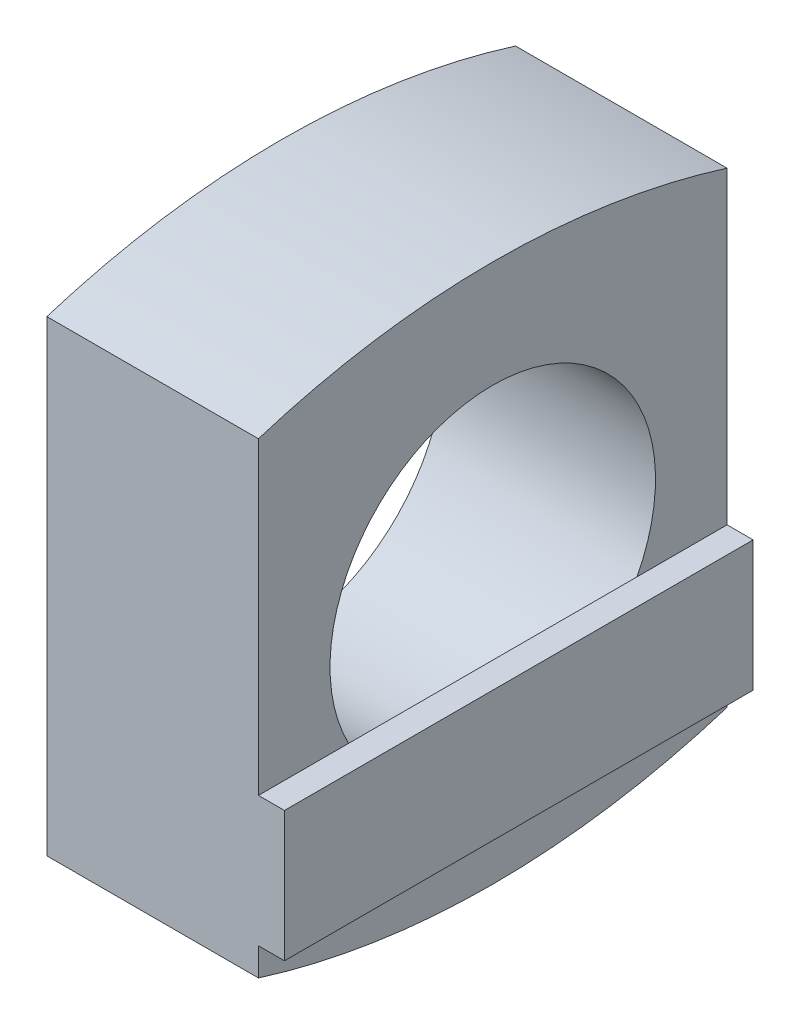
ISO-10303-21;
HEADER;
FILE_DESCRIPTION(('STEP AP214'),'2;1');
FILE_NAME('part.step','',(''),(''),'','','');
FILE_SCHEMA(('AUTOMOTIVE_DESIGN { 1 0 10303 214 1 1 1 1 }'));
ENDSEC;
DATA;
#1=APPLICATION_CONTEXT('core data for automotive mechanical design processes');
#2=APPLICATION_PROTOCOL_DEFINITION('international standard','automotive_design',2000,#1);
#3=PRODUCT_CONTEXT('',#1,'mechanical');
#4=PRODUCT('Part','Part','',(#3));
#5=PRODUCT_RELATED_PRODUCT_CATEGORY('part','',(#4));
#6=PRODUCT_DEFINITION_FORMATION('','',#4);
#7=PRODUCT_DEFINITION_CONTEXT('part definition',#1,'design');
#8=PRODUCT_DEFINITION('design','',#6,#7);
#9=PRODUCT_DEFINITION_SHAPE('','',#8);
#10=(LENGTH_UNIT() NAMED_UNIT(*) SI_UNIT(.MILLI.,.METRE.));
#11=(NAMED_UNIT(*) PLANE_ANGLE_UNIT() SI_UNIT($,.RADIAN.));
#12=(NAMED_UNIT(*) SI_UNIT($,.STERADIAN.) SOLID_ANGLE_UNIT());
#13=UNCERTAINTY_MEASURE_WITH_UNIT(LENGTH_MEASURE(1.E-05),#10,'distance_accuracy_value','');
#14=(GEOMETRIC_REPRESENTATION_CONTEXT(3) GLOBAL_UNCERTAINTY_ASSIGNED_CONTEXT((#13)) GLOBAL_UNIT_ASSIGNED_CONTEXT((#10,
#11,#12)) REPRESENTATION_CONTEXT('',''));
#15=CARTESIAN_POINT('',(0.,0.,0.));
#16=DIRECTION('',(0.,0.,1.));
#17=DIRECTION('',(1.,0.,0.));
#18=AXIS2_PLACEMENT_3D('',#15,#16,#17);
#19=CARTESIAN_POINT('',(20.6375,50.8498920527703,-83.5241282937344));
#20=DIRECTION('',(-1.,0.,0.));
#21=DIRECTION('',(0.,0.,1.));
#22=AXIS2_PLACEMENT_3D('',#19,#20,#21);
#23=PLANE('',#22);
#24=DIRECTION('',(0.,0.,1.));
#25=VECTOR('',#24,1.);
#26=CARTESIAN_POINT('',(20.6375,-6.41610430488165,-60.6641282937344));
#27=LINE('',#26,#25);
#28=CARTESIAN_POINT('',(20.6375,-6.41610430488165,-106.384128293734));
#29=VERTEX_POINT('',#28);
#30=CARTESIAN_POINT('',(20.6375,-6.41610430488165,-97.5925202977598));
#31=VERTEX_POINT('',#30);
#32=EDGE_CURVE('E43',#29,#31,#27,.T.);
#33=ORIENTED_EDGE('',*,*,#32,.F.);
#34=DIRECTION('',(0.,-1.,0.));
#35=VECTOR('',#34,1.);
#36=CARTESIAN_POINT('',(20.6375,0.938892052770313,-106.384128293734));
#37=LINE('',#36,#35);
#38=CARTESIAN_POINT('',(20.6375,23.7180592007416,-106.384128293734));
#39=VERTEX_POINT('',#38);
#40=EDGE_CURVE('E155',#39,#29,#37,.T.);
#41=ORIENTED_EDGE('',*,*,#40,.F.);
#42=CARTESIAN_POINT('',(20.6375,-48.9721079472297,-83.5241282937344));
#43=DIRECTION('',(1.,0.,0.));
#44=DIRECTION('',(0.,0.,1.));
#45=AXIS2_PLACEMENT_3D('',#42,#43,#44);
#46=CIRCLE('',#45,76.2);
#47=CARTESIAN_POINT('',(20.6375,23.7180592007416,-60.6641282937344));
#48=VERTEX_POINT('',#47);
#49=EDGE_CURVE('E133',#39,#48,#46,.T.);
#50=ORIENTED_EDGE('',*,*,#49,.T.);
#51=DIRECTION('',(0.,-1.,0.));
#52=VECTOR('',#51,1.);
#53=CARTESIAN_POINT('',(20.6375,0.938892052770313,-60.6641282937344));
#54=LINE('',#53,#52);
#55=CARTESIAN_POINT('',(20.6375,-6.41610430488165,-60.6641282937344));
#56=VERTEX_POINT('',#55);
#57=EDGE_CURVE('E161',#48,#56,#54,.T.);
#58=ORIENTED_EDGE('',*,*,#57,.T.);
#59=CARTESIAN_POINT('',(20.6375,-6.41610430488165,-69.455736289709));
#60=VERTEX_POINT('',#59);
#61=EDGE_CURVE('E11',#60,#56,#27,.T.);
#62=ORIENTED_EDGE('',*,*,#61,.F.);
#63=CARTESIAN_POINT('',(20.6375,0.938892052770313,-83.5241282937344));
#64=DIRECTION('',(1.,0.,0.));
#65=DIRECTION('',(0.,0.,-1.));
#66=AXIS2_PLACEMENT_3D('',#63,#64,#65);
#67=CIRCLE('',#66,15.875);
#68=EDGE_CURVE('E152',#31,#60,#67,.T.);
#69=ORIENTED_EDGE('',*,*,#68,.F.);
#70=EDGE_LOOP('',(#33,#41,#50,#58,#62,#69));
#71=FACE_BOUND('',#70,.T.);
#72=ADVANCED_FACE('F32',(#71),#23,.F.);
#73=DIRECTION('',(0.,0.,-1.));
#74=VECTOR('',#73,1.);
#75=CARTESIAN_POINT('',(20.6375,-19.1161043048817,-60.6641282937344));
#76=LINE('',#75,#74);
#77=CARTESIAN_POINT('',(20.6375,-19.1161043048817,-60.6641282937344));
#78=VERTEX_POINT('',#77);
#79=CARTESIAN_POINT('',(20.6375,-19.1161043048817,-106.384128293734));
#80=VERTEX_POINT('',#79);
#81=EDGE_CURVE('E58',#78,#80,#76,.T.);
#82=ORIENTED_EDGE('',*,*,#81,.F.);
#83=CARTESIAN_POINT('',(20.6375,-21.840275095201,-60.6641282937344));
#84=VERTEX_POINT('',#83);
#85=EDGE_CURVE('E129',#78,#84,#54,.T.);
#86=ORIENTED_EDGE('',*,*,#85,.T.);
#87=CARTESIAN_POINT('',(20.6375,50.8498920527703,-83.5241282937344));
#88=DIRECTION('',(-1.,0.,0.));
#89=DIRECTION('',(0.,0.,1.));
#90=AXIS2_PLACEMENT_3D('',#87,#88,#89);
#91=CIRCLE('',#90,76.2);
#92=CARTESIAN_POINT('',(20.6375,-21.840275095201,-106.384128293734));
#93=VERTEX_POINT('',#92);
#94=EDGE_CURVE('E157',#93,#84,#91,.T.);
#95=ORIENTED_EDGE('',*,*,#94,.F.);
#96=EDGE_CURVE('E158',#80,#93,#37,.T.);
#97=ORIENTED_EDGE('',*,*,#96,.F.);
#98=EDGE_LOOP('',(#82,#86,#95,#97));
#99=FACE_BOUND('',#98,.T.);
#100=ADVANCED_FACE('F200',(#99),#23,.F.);
#101=CARTESIAN_POINT('',(0.,50.8498920527703,-83.5241282937344));
#102=DIRECTION('',(-1.,0.,0.));
#103=DIRECTION('',(0.,0.,1.));
#104=AXIS2_PLACEMENT_3D('',#101,#102,#103);
#105=PLANE('',#104);
#106=CARTESIAN_POINT('',(0.,0.938892052770313,-83.5241282937344));
#107=DIRECTION('',(1.,0.,0.));
#108=DIRECTION('',(0.,0.,-1.));
#109=AXIS2_PLACEMENT_3D('',#106,#107,#108);
#110=CIRCLE('',#109,15.875);
#111=CARTESIAN_POINT('',(0.,0.938892052770313,-99.3991282937344));
#112=VERTEX_POINT('',#111);
#113=EDGE_CURVE('E145',#112,#112,#110,.T.);
#114=ORIENTED_EDGE('',*,*,#113,.T.);
#115=EDGE_LOOP('',(#114));
#116=FACE_BOUND('',#115,.T.);
#117=DIRECTION('',(0.,-1.,0.));
#118=VECTOR('',#117,1.);
#119=CARTESIAN_POINT('',(0.,0.938892052770313,-60.6641282937344));
#120=LINE('',#119,#118);
#121=CARTESIAN_POINT('',(0.,23.7180592007416,-60.6641282937344));
#122=VERTEX_POINT('',#121);
#123=CARTESIAN_POINT('',(0.,-21.840275095201,-60.6641282937344));
#124=VERTEX_POINT('',#123);
#125=EDGE_CURVE('E168',#122,#124,#120,.T.);
#126=ORIENTED_EDGE('',*,*,#125,.F.);
#127=CARTESIAN_POINT('',(0.,-48.9721079472297,-83.5241282937344));
#128=DIRECTION('',(1.,0.,0.));
#129=DIRECTION('',(0.,0.,1.));
#130=AXIS2_PLACEMENT_3D('',#127,#128,#129);
#131=CIRCLE('',#130,76.2);
#132=CARTESIAN_POINT('',(0.,23.7180592007416,-106.384128293734));
#133=VERTEX_POINT('',#132);
#134=EDGE_CURVE('E130',#133,#122,#131,.T.);
#135=ORIENTED_EDGE('',*,*,#134,.F.);
#136=DIRECTION('',(0.,-1.,0.));
#137=VECTOR('',#136,1.);
#138=CARTESIAN_POINT('',(0.,0.938892052770313,-106.384128293734));
#139=LINE('',#138,#137);
#140=CARTESIAN_POINT('',(0.,-21.840275095201,-106.384128293734));
#141=VERTEX_POINT('',#140);
#142=EDGE_CURVE('E151',#133,#141,#139,.T.);
#143=ORIENTED_EDGE('',*,*,#142,.T.);
#144=CARTESIAN_POINT('',(0.,50.8498920527703,-83.5241282937344));
#145=DIRECTION('',(-1.,0.,0.));
#146=DIRECTION('',(0.,0.,1.));
#147=AXIS2_PLACEMENT_3D('',#144,#145,#146);
#148=CIRCLE('',#147,76.2);
#149=EDGE_CURVE('E165',#141,#124,#148,.T.);
#150=ORIENTED_EDGE('',*,*,#149,.T.);
#151=EDGE_LOOP('',(#126,#135,#143,#150));
#152=FACE_BOUND('',#151,.T.);
#153=ADVANCED_FACE('F178',(#116,#152),#105,.T.);
#154=CARTESIAN_POINT('',(20.6375,0.938892052770313,-106.384128293734));
#155=DIRECTION('',(0.,0.,-1.));
#156=DIRECTION('',(-1.,0.,0.));
#157=AXIS2_PLACEMENT_3D('',#154,#155,#156);
#158=PLANE('',#157);
#159=ORIENTED_EDGE('',*,*,#142,.F.);
#160=DIRECTION('',(-1.,0.,0.));
#161=VECTOR('',#160,1.);
#162=CARTESIAN_POINT('',(20.6375,23.7180592007416,-106.384128293734));
#163=LINE('',#162,#161);
#164=EDGE_CURVE('E142',#39,#133,#163,.T.);
#165=ORIENTED_EDGE('',*,*,#164,.F.);
#166=ORIENTED_EDGE('',*,*,#40,.T.);
#167=DIRECTION('',(-1.,0.,0.));
#168=VECTOR('',#167,1.);
#169=CARTESIAN_POINT('',(23.1775,-6.41610430488165,-106.384128293734));
#170=LINE('',#169,#168);
#171=CARTESIAN_POINT('',(23.1775,-6.41610430488165,-106.384128293734));
#172=VERTEX_POINT('',#171);
#173=EDGE_CURVE('E135',#172,#29,#170,.T.);
#174=ORIENTED_EDGE('',*,*,#173,.F.);
#175=DIRECTION('',(0.,1.,0.));
#176=VECTOR('',#175,1.);
#177=CARTESIAN_POINT('',(23.1775,-6.41610430488165,-106.384128293734));
#178=LINE('',#177,#176);
#179=CARTESIAN_POINT('',(23.1775,-19.1161043048817,-106.384128293734));
#180=VERTEX_POINT('',#179);
#181=EDGE_CURVE('E115',#180,#172,#178,.T.);
#182=ORIENTED_EDGE('',*,*,#181,.F.);
#183=DIRECTION('',(-1.,0.,0.));
#184=VECTOR('',#183,1.);
#185=CARTESIAN_POINT('',(23.1775,-19.1161043048817,-106.384128293734));
#186=LINE('',#185,#184);
#187=EDGE_CURVE('E112',#180,#80,#186,.T.);
#188=ORIENTED_EDGE('',*,*,#187,.T.);
#189=ORIENTED_EDGE('',*,*,#96,.T.);
#190=DIRECTION('',(-1.,0.,0.));
#191=VECTOR('',#190,1.);
#192=CARTESIAN_POINT('',(20.6375,-21.840275095201,-106.384128293734));
#193=LINE('',#192,#191);
#194=EDGE_CURVE('E36',#93,#141,#193,.T.);
#195=ORIENTED_EDGE('',*,*,#194,.T.);
#196=EDGE_LOOP('',(#159,#165,#166,#174,#182,#188,#189,#195));
#197=FACE_BOUND('',#196,.T.);
#198=ADVANCED_FACE('F34',(#197),#158,.T.);
#199=CARTESIAN_POINT('',(20.6375,0.938892052770313,-60.6641282937344));
#200=DIRECTION('',(0.,0.,-1.));
#201=DIRECTION('',(0.,1.,0.));
#202=AXIS2_PLACEMENT_3D('',#199,#200,#201);
#203=PLANE('',#202);
#204=ORIENTED_EDGE('',*,*,#125,.T.);
#205=DIRECTION('',(-1.,0.,0.));
#206=VECTOR('',#205,1.);
#207=CARTESIAN_POINT('',(20.6375,-21.840275095201,-60.6641282937344));
#208=LINE('',#207,#206);
#209=EDGE_CURVE('E41',#84,#124,#208,.T.);
#210=ORIENTED_EDGE('',*,*,#209,.F.);
#211=ORIENTED_EDGE('',*,*,#85,.F.);
#212=DIRECTION('',(-1.,0.,0.));
#213=VECTOR('',#212,1.);
#214=CARTESIAN_POINT('',(23.1775,-19.1161043048817,-60.6641282937344));
#215=LINE('',#214,#213);
#216=CARTESIAN_POINT('',(23.1775,-19.1161043048817,-60.6641282937344));
#217=VERTEX_POINT('',#216);
#218=EDGE_CURVE('E110',#217,#78,#215,.T.);
#219=ORIENTED_EDGE('',*,*,#218,.F.);
#220=DIRECTION('',(0.,-1.,0.));
#221=VECTOR('',#220,1.);
#222=CARTESIAN_POINT('',(23.1775,-6.41610430488165,-60.6641282937344));
#223=LINE('',#222,#221);
#224=CARTESIAN_POINT('',(23.1775,-6.41610430488165,-60.6641282937344));
#225=VERTEX_POINT('',#224);
#226=EDGE_CURVE('E116',#225,#217,#223,.T.);
#227=ORIENTED_EDGE('',*,*,#226,.F.);
#228=DIRECTION('',(-1.,0.,0.));
#229=VECTOR('',#228,1.);
#230=CARTESIAN_POINT('',(23.1775,-6.41610430488165,-60.6641282937344));
#231=LINE('',#230,#229);
#232=EDGE_CURVE('E188',#225,#56,#231,.T.);
#233=ORIENTED_EDGE('',*,*,#232,.T.);
#234=ORIENTED_EDGE('',*,*,#57,.F.);
#235=DIRECTION('',(-1.,0.,0.));
#236=VECTOR('',#235,1.);
#237=CARTESIAN_POINT('',(20.6375,23.7180592007416,-60.6641282937344));
#238=LINE('',#237,#236);
#239=EDGE_CURVE('E140',#48,#122,#238,.T.);
#240=ORIENTED_EDGE('',*,*,#239,.T.);
#241=EDGE_LOOP('',(#204,#210,#211,#219,#227,#233,#234,#240));
#242=FACE_BOUND('',#241,.T.);
#243=ADVANCED_FACE('F127',(#242),#203,.F.);
#244=CARTESIAN_POINT('',(20.6375,50.8498920527703,-83.5241282937344));
#245=DIRECTION('',(-1.,0.,0.));
#246=DIRECTION('',(0.,0.,1.));
#247=AXIS2_PLACEMENT_3D('',#244,#245,#246);
#248=CYLINDRICAL_SURFACE('',#247,76.2);
#249=ORIENTED_EDGE('',*,*,#149,.F.);
#250=ORIENTED_EDGE('',*,*,#194,.F.);
#251=ORIENTED_EDGE('',*,*,#94,.T.);
#252=ORIENTED_EDGE('',*,*,#209,.T.);
#253=EDGE_LOOP('',(#249,#250,#251,#252));
#254=FACE_BOUND('',#253,.T.);
#255=ADVANCED_FACE('F176',(#254),#248,.T.);
#256=CARTESIAN_POINT('',(20.6375,0.938892052770313,-83.5241282937344));
#257=DIRECTION('',(-1.,0.,0.));
#258=DIRECTION('',(0.,0.,1.));
#259=AXIS2_PLACEMENT_3D('',#256,#257,#258);
#260=CYLINDRICAL_SURFACE('',#259,15.875);
#261=ORIENTED_EDGE('',*,*,#113,.F.);
#262=EDGE_LOOP('',(#261));
#263=FACE_BOUND('',#262,.T.);
#264=EDGE_CURVE('E148',#60,#31,#67,.T.);
#265=ORIENTED_EDGE('',*,*,#264,.T.);
#266=ORIENTED_EDGE('',*,*,#68,.T.);
#267=EDGE_LOOP('',(#265,#266));
#268=FACE_BOUND('',#267,.T.);
#269=ADVANCED_FACE('F199',(#263,#268),#260,.F.);
#270=CARTESIAN_POINT('',(20.6375,-48.9721079472297,-83.5241282937344));
#271=DIRECTION('',(-1.,0.,0.));
#272=DIRECTION('',(0.,0.,1.));
#273=AXIS2_PLACEMENT_3D('',#270,#271,#272);
#274=CYLINDRICAL_SURFACE('',#273,76.2);
#275=ORIENTED_EDGE('',*,*,#134,.T.);
#276=ORIENTED_EDGE('',*,*,#239,.F.);
#277=ORIENTED_EDGE('',*,*,#49,.F.);
#278=ORIENTED_EDGE('',*,*,#164,.T.);
#279=EDGE_LOOP('',(#275,#276,#277,#278));
#280=FACE_BOUND('',#279,.T.);
#281=ADVANCED_FACE('F182',(#280),#274,.T.);
#282=CARTESIAN_POINT('',(23.1775,-19.1161043048817,-60.6641282937344));
#283=DIRECTION('',(0.,1.,0.));
#284=DIRECTION('',(0.,0.,1.));
#285=AXIS2_PLACEMENT_3D('',#282,#283,#284);
#286=PLANE('',#285);
#287=ORIENTED_EDGE('',*,*,#81,.T.);
#288=ORIENTED_EDGE('',*,*,#187,.F.);
#289=DIRECTION('',(0.,0.,-1.));
#290=VECTOR('',#289,1.);
#291=CARTESIAN_POINT('',(23.1775,-19.1161043048817,-60.6641282937344));
#292=LINE('',#291,#290);
#293=EDGE_CURVE('E106',#217,#180,#292,.T.);
#294=ORIENTED_EDGE('',*,*,#293,.F.);
#295=ORIENTED_EDGE('',*,*,#218,.T.);
#296=EDGE_LOOP('',(#287,#288,#294,#295));
#297=FACE_BOUND('',#296,.T.);
#298=ADVANCED_FACE('F108',(#297),#286,.F.);
#299=CARTESIAN_POINT('',(23.1775,-6.41610430488165,-60.6641282937344));
#300=DIRECTION('',(0.,-1.,0.));
#301=DIRECTION('',(0.,0.,-1.));
#302=AXIS2_PLACEMENT_3D('',#299,#300,#301);
#303=PLANE('',#302);
#304=ORIENTED_EDGE('',*,*,#32,.T.);
#305=EDGE_CURVE('E44',#31,#60,#27,.T.);
#306=ORIENTED_EDGE('',*,*,#305,.T.);
#307=ORIENTED_EDGE('',*,*,#61,.T.);
#308=ORIENTED_EDGE('',*,*,#232,.F.);
#309=DIRECTION('',(0.,0.,1.));
#310=VECTOR('',#309,1.);
#311=CARTESIAN_POINT('',(23.1775,-6.41610430488165,-60.6641282937344));
#312=LINE('',#311,#310);
#313=EDGE_CURVE('E121',#172,#225,#312,.T.);
#314=ORIENTED_EDGE('',*,*,#313,.F.);
#315=ORIENTED_EDGE('',*,*,#173,.T.);
#316=EDGE_LOOP('',(#304,#306,#307,#308,#314,#315));
#317=FACE_BOUND('',#316,.T.);
#318=ADVANCED_FACE('F186',(#317),#303,.F.);
#319=CARTESIAN_POINT('',(23.1775,0.,0.));
#320=DIRECTION('',(1.,0.,0.));
#321=DIRECTION('',(0.,0.,-1.));
#322=AXIS2_PLACEMENT_3D('',#319,#320,#321);
#323=PLANE('',#322);
#324=ORIENTED_EDGE('',*,*,#226,.T.);
#325=ORIENTED_EDGE('',*,*,#293,.T.);
#326=ORIENTED_EDGE('',*,*,#181,.T.);
#327=ORIENTED_EDGE('',*,*,#313,.T.);
#328=EDGE_LOOP('',(#324,#325,#326,#327));
#329=FACE_BOUND('',#328,.T.);
#330=ADVANCED_FACE('F119',(#329),#323,.T.);
#331=CARTESIAN_POINT('',(20.6375,0.,0.));
#332=DIRECTION('',(1.,0.,0.));
#333=DIRECTION('',(0.,0.,-1.));
#334=AXIS2_PLACEMENT_3D('',#331,#332,#333);
#335=PLANE('',#334);
#336=ORIENTED_EDGE('',*,*,#264,.F.);
#337=ORIENTED_EDGE('',*,*,#305,.F.);
#338=EDGE_LOOP('',(#336,#337));
#339=FACE_BOUND('',#338,.T.);
#340=ADVANCED_FACE('F196',(#339),#335,.F.);
#341=CLOSED_SHELL('',(#72,#100,#153,#198,#243,#255,#269,#281,#298,#318,#330,#340));
#342=MANIFOLD_SOLID_BREP('B2',#341);
#343=ADVANCED_BREP_SHAPE_REPRESENTATION('',(#18,#342),#14);
#344=SHAPE_DEFINITION_REPRESENTATION(#9,#343);
ENDSEC;
END-ISO-10303-21;
